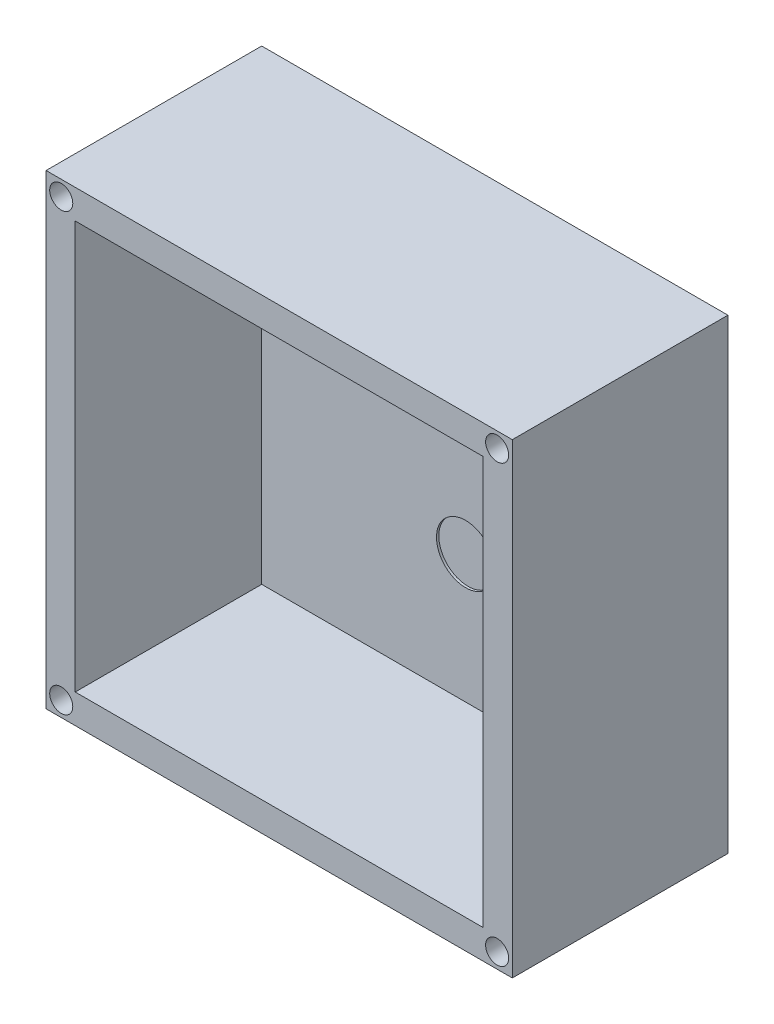
ISO-10303-21;
HEADER;
FILE_DESCRIPTION(('STEP AP214'),'2;1');
FILE_NAME('part.step','',(''),(''),'','','');
FILE_SCHEMA(('AUTOMOTIVE_DESIGN { 1 0 10303 214 1 1 1 1 }'));
ENDSEC;
DATA;
#1=APPLICATION_CONTEXT('core data for automotive mechanical design processes');
#2=APPLICATION_PROTOCOL_DEFINITION('international standard','automotive_design',2000,#1);
#3=PRODUCT_CONTEXT('',#1,'mechanical');
#4=PRODUCT('Part','Part','',(#3));
#5=PRODUCT_RELATED_PRODUCT_CATEGORY('part','',(#4));
#6=PRODUCT_DEFINITION_FORMATION('','',#4);
#7=PRODUCT_DEFINITION_CONTEXT('part definition',#1,'design');
#8=PRODUCT_DEFINITION('design','',#6,#7);
#9=PRODUCT_DEFINITION_SHAPE('','',#8);
#10=(LENGTH_UNIT() NAMED_UNIT(*) SI_UNIT(.MILLI.,.METRE.));
#11=(NAMED_UNIT(*) PLANE_ANGLE_UNIT() SI_UNIT($,.RADIAN.));
#12=(NAMED_UNIT(*) SI_UNIT($,.STERADIAN.) SOLID_ANGLE_UNIT());
#13=UNCERTAINTY_MEASURE_WITH_UNIT(LENGTH_MEASURE(1.E-05),#10,'distance_accuracy_value','');
#14=(GEOMETRIC_REPRESENTATION_CONTEXT(3) GLOBAL_UNCERTAINTY_ASSIGNED_CONTEXT((#13)) GLOBAL_UNIT_ASSIGNED_CONTEXT((#10,
#11,#12)) REPRESENTATION_CONTEXT('',''));
#15=CARTESIAN_POINT('',(0.,0.,0.));
#16=DIRECTION('',(0.,0.,1.));
#17=DIRECTION('',(1.,0.,0.));
#18=AXIS2_PLACEMENT_3D('',#15,#16,#17);
#19=CARTESIAN_POINT('',(0.,0.,3.175));
#20=DIRECTION('',(1.,0.,0.));
#21=DIRECTION('',(0.,1.,0.));
#22=AXIS2_PLACEMENT_3D('',#19,#20,#21);
#23=PLANE('',#22);
#24=DIRECTION('',(0.,-1.,0.));
#25=VECTOR('',#24,1.);
#26=CARTESIAN_POINT('',(0.,0.,0.));
#27=LINE('',#26,#25);
#28=CARTESIAN_POINT('',(0.,50.8,0.));
#29=VERTEX_POINT('',#28);
#30=CARTESIAN_POINT('',(0.,0.,0.));
#31=VERTEX_POINT('',#30);
#32=EDGE_CURVE('E158',#29,#31,#27,.T.);
#33=ORIENTED_EDGE('',*,*,#32,.T.);
#34=DIRECTION('',(0.,0.,-1.));
#35=VECTOR('',#34,1.);
#36=CARTESIAN_POINT('',(0.,0.,3.175));
#37=LINE('',#36,#35);
#38=CARTESIAN_POINT('',(0.,0.,23.495));
#39=VERTEX_POINT('',#38);
#40=EDGE_CURVE('E11',#39,#31,#37,.T.);
#41=ORIENTED_EDGE('',*,*,#40,.F.);
#42=DIRECTION('',(0.,-1.,0.));
#43=VECTOR('',#42,1.);
#44=CARTESIAN_POINT('',(0.,50.8,23.495));
#45=LINE('',#44,#43);
#46=CARTESIAN_POINT('',(0.,50.8,23.495));
#47=VERTEX_POINT('',#46);
#48=EDGE_CURVE('E121',#47,#39,#45,.T.);
#49=ORIENTED_EDGE('',*,*,#48,.F.);
#50=DIRECTION('',(0.,0.,-1.));
#51=VECTOR('',#50,1.);
#52=CARTESIAN_POINT('',(0.,50.8,3.175));
#53=LINE('',#52,#51);
#54=EDGE_CURVE('E166',#47,#29,#53,.T.);
#55=ORIENTED_EDGE('',*,*,#54,.T.);
#56=EDGE_LOOP('',(#33,#41,#49,#55));
#57=FACE_BOUND('',#56,.T.);
#58=ADVANCED_FACE('F39',(#57),#23,.F.);
#59=CARTESIAN_POINT('',(0.,0.,3.175));
#60=DIRECTION('',(0.,1.,0.));
#61=DIRECTION('',(0.,0.,1.));
#62=AXIS2_PLACEMENT_3D('',#59,#60,#61);
#63=PLANE('',#62);
#64=DIRECTION('',(1.,0.,0.));
#65=VECTOR('',#64,1.);
#66=CARTESIAN_POINT('',(0.,0.,0.));
#67=LINE('',#66,#65);
#68=CARTESIAN_POINT('',(50.8,0.,0.));
#69=VERTEX_POINT('',#68);
#70=EDGE_CURVE('E161',#31,#69,#67,.T.);
#71=ORIENTED_EDGE('',*,*,#70,.T.);
#72=DIRECTION('',(0.,0.,-1.));
#73=VECTOR('',#72,1.);
#74=CARTESIAN_POINT('',(50.8,0.,3.175));
#75=LINE('',#74,#73);
#76=CARTESIAN_POINT('',(50.8,0.,23.495));
#77=VERTEX_POINT('',#76);
#78=EDGE_CURVE('E46',#77,#69,#75,.T.);
#79=ORIENTED_EDGE('',*,*,#78,.F.);
#80=DIRECTION('',(1.,0.,0.));
#81=VECTOR('',#80,1.);
#82=CARTESIAN_POINT('',(0.,0.,23.495));
#83=LINE('',#82,#81);
#84=EDGE_CURVE('E149',#39,#77,#83,.T.);
#85=ORIENTED_EDGE('',*,*,#84,.F.);
#86=ORIENTED_EDGE('',*,*,#40,.T.);
#87=EDGE_LOOP('',(#71,#79,#85,#86));
#88=FACE_BOUND('',#87,.T.);
#89=ADVANCED_FACE('F184',(#88),#63,.F.);
#90=CARTESIAN_POINT('',(50.8,0.,3.175));
#91=DIRECTION('',(-1.,0.,0.));
#92=DIRECTION('',(0.,0.,1.));
#93=AXIS2_PLACEMENT_3D('',#90,#91,#92);
#94=PLANE('',#93);
#95=DIRECTION('',(0.,1.,0.));
#96=VECTOR('',#95,1.);
#97=CARTESIAN_POINT('',(50.8,0.,0.));
#98=LINE('',#97,#96);
#99=CARTESIAN_POINT('',(50.8,50.8,0.));
#100=VERTEX_POINT('',#99);
#101=EDGE_CURVE('E163',#69,#100,#98,.T.);
#102=ORIENTED_EDGE('',*,*,#101,.T.);
#103=DIRECTION('',(0.,0.,-1.));
#104=VECTOR('',#103,1.);
#105=CARTESIAN_POINT('',(50.8,50.8,3.175));
#106=LINE('',#105,#104);
#107=CARTESIAN_POINT('',(50.8,50.8,23.495));
#108=VERTEX_POINT('',#107);
#109=EDGE_CURVE('E168',#108,#100,#106,.T.);
#110=ORIENTED_EDGE('',*,*,#109,.F.);
#111=DIRECTION('',(0.,1.,0.));
#112=VECTOR('',#111,1.);
#113=CARTESIAN_POINT('',(50.8,50.8,23.495));
#114=LINE('',#113,#112);
#115=EDGE_CURVE('E152',#77,#108,#114,.T.);
#116=ORIENTED_EDGE('',*,*,#115,.F.);
#117=ORIENTED_EDGE('',*,*,#78,.T.);
#118=EDGE_LOOP('',(#102,#110,#116,#117));
#119=FACE_BOUND('',#118,.T.);
#120=ADVANCED_FACE('F173',(#119),#94,.F.);
#121=CARTESIAN_POINT('',(0.,50.8,3.175));
#122=DIRECTION('',(0.,-1.,0.));
#123=DIRECTION('',(0.,0.,-1.));
#124=AXIS2_PLACEMENT_3D('',#121,#122,#123);
#125=PLANE('',#124);
#126=DIRECTION('',(-1.,0.,0.));
#127=VECTOR('',#126,1.);
#128=CARTESIAN_POINT('',(0.,50.8,0.));
#129=LINE('',#128,#127);
#130=EDGE_CURVE('E61',#100,#29,#129,.T.);
#131=ORIENTED_EDGE('',*,*,#130,.T.);
#132=ORIENTED_EDGE('',*,*,#54,.F.);
#133=DIRECTION('',(-1.,0.,0.));
#134=VECTOR('',#133,1.);
#135=CARTESIAN_POINT('',(0.,50.8,23.495));
#136=LINE('',#135,#134);
#137=EDGE_CURVE('E155',#108,#47,#136,.T.);
#138=ORIENTED_EDGE('',*,*,#137,.F.);
#139=ORIENTED_EDGE('',*,*,#109,.T.);
#140=EDGE_LOOP('',(#131,#132,#138,#139));
#141=FACE_BOUND('',#140,.T.);
#142=ADVANCED_FACE('F182',(#141),#125,.F.);
#143=CARTESIAN_POINT('',(0.,0.,0.));
#144=DIRECTION('',(0.,0.,-1.));
#145=DIRECTION('',(-1.,0.,0.));
#146=AXIS2_PLACEMENT_3D('',#143,#144,#145);
#147=PLANE('',#146);
#148=CARTESIAN_POINT('',(25.39365,35.1409,0.));
#149=DIRECTION('',(0.,0.,1.));
#150=DIRECTION('',(1.,0.,0.));
#151=AXIS2_PLACEMENT_3D('',#148,#149,#150);
#152=CIRCLE('',#151,3.175);
#153=CARTESIAN_POINT('',(28.56865,35.1409,0.));
#154=VERTEX_POINT('',#153);
#155=EDGE_CURVE('E263',#154,#154,#152,.T.);
#156=ORIENTED_EDGE('',*,*,#155,.T.);
#157=EDGE_LOOP('',(#156));
#158=FACE_BOUND('',#157,.T.);
#159=ORIENTED_EDGE('',*,*,#32,.F.);
#160=ORIENTED_EDGE('',*,*,#130,.F.);
#161=ORIENTED_EDGE('',*,*,#101,.F.);
#162=ORIENTED_EDGE('',*,*,#70,.F.);
#163=EDGE_LOOP('',(#159,#160,#161,#162));
#164=FACE_BOUND('',#163,.T.);
#165=ADVANCED_FACE('F178',(#158,#164),#147,.T.);
#166=CARTESIAN_POINT('',(0.,0.,23.495));
#167=DIRECTION('',(0.,0.,1.));
#168=DIRECTION('',(1.,0.,0.));
#169=AXIS2_PLACEMENT_3D('',#166,#167,#168);
#170=PLANE('',#169);
#171=CARTESIAN_POINT('',(1.65099999999998,1.651,23.495));
#172=DIRECTION('',(0.,0.,1.));
#173=DIRECTION('',(1.,0.,0.));
#174=AXIS2_PLACEMENT_3D('',#171,#172,#173);
#175=CIRCLE('',#174,1.2573);
#176=CARTESIAN_POINT('',(2.90829999999998,1.651,23.495));
#177=VERTEX_POINT('',#176);
#178=EDGE_CURVE('E284',#177,#177,#175,.T.);
#179=ORIENTED_EDGE('',*,*,#178,.F.);
#180=EDGE_LOOP('',(#179));
#181=FACE_BOUND('',#180,.T.);
#182=CARTESIAN_POINT('',(49.149,1.651,23.495));
#183=DIRECTION('',(0.,0.,1.));
#184=DIRECTION('',(1.,0.,0.));
#185=AXIS2_PLACEMENT_3D('',#182,#183,#184);
#186=CIRCLE('',#185,1.2573);
#187=CARTESIAN_POINT('',(50.4063,1.651,23.495));
#188=VERTEX_POINT('',#187);
#189=EDGE_CURVE('E278',#188,#188,#186,.T.);
#190=ORIENTED_EDGE('',*,*,#189,.F.);
#191=EDGE_LOOP('',(#190));
#192=FACE_BOUND('',#191,.T.);
#193=CARTESIAN_POINT('',(49.149,49.149,23.495));
#194=DIRECTION('',(0.,0.,1.));
#195=DIRECTION('',(1.,0.,0.));
#196=AXIS2_PLACEMENT_3D('',#193,#194,#195);
#197=CIRCLE('',#196,1.2573);
#198=CARTESIAN_POINT('',(50.4063,49.149,23.495));
#199=VERTEX_POINT('',#198);
#200=EDGE_CURVE('E271',#199,#199,#197,.T.);
#201=ORIENTED_EDGE('',*,*,#200,.F.);
#202=EDGE_LOOP('',(#201));
#203=FACE_BOUND('',#202,.T.);
#204=CARTESIAN_POINT('',(1.65100000000001,49.149,23.495));
#205=DIRECTION('',(0.,0.,1.));
#206=DIRECTION('',(1.,0.,0.));
#207=AXIS2_PLACEMENT_3D('',#204,#205,#206);
#208=CIRCLE('',#207,1.2573);
#209=CARTESIAN_POINT('',(2.9083,49.149,23.495));
#210=VERTEX_POINT('',#209);
#211=EDGE_CURVE('E274',#210,#210,#208,.T.);
#212=ORIENTED_EDGE('',*,*,#211,.F.);
#213=EDGE_LOOP('',(#212));
#214=FACE_BOUND('',#213,.T.);
#215=ORIENTED_EDGE('',*,*,#48,.T.);
#216=ORIENTED_EDGE('',*,*,#84,.T.);
#217=ORIENTED_EDGE('',*,*,#115,.T.);
#218=ORIENTED_EDGE('',*,*,#137,.T.);
#219=EDGE_LOOP('',(#215,#216,#217,#218));
#220=FACE_BOUND('',#219,.T.);
#221=DIRECTION('',(1.,0.,0.));
#222=VECTOR('',#221,1.);
#223=CARTESIAN_POINT('',(3.175,3.175,23.495));
#224=LINE('',#223,#222);
#225=CARTESIAN_POINT('',(3.175,3.175,23.495));
#226=VERTEX_POINT('',#225);
#227=CARTESIAN_POINT('',(47.6123,3.175,23.495));
#228=VERTEX_POINT('',#227);
#229=EDGE_CURVE('E113',#226,#228,#224,.T.);
#230=ORIENTED_EDGE('',*,*,#229,.F.);
#231=DIRECTION('',(0.,-1.,0.));
#232=VECTOR('',#231,1.);
#233=CARTESIAN_POINT('',(3.175,47.625,23.495));
#234=LINE('',#233,#232);
#235=CARTESIAN_POINT('',(3.175,47.625,23.495));
#236=VERTEX_POINT('',#235);
#237=EDGE_CURVE('E105',#236,#226,#234,.T.);
#238=ORIENTED_EDGE('',*,*,#237,.F.);
#239=DIRECTION('',(-1.,0.,0.));
#240=VECTOR('',#239,1.);
#241=CARTESIAN_POINT('',(3.175,47.625,23.495));
#242=LINE('',#241,#240);
#243=CARTESIAN_POINT('',(47.6123,47.625,23.495));
#244=VERTEX_POINT('',#243);
#245=EDGE_CURVE('E129',#244,#236,#242,.T.);
#246=ORIENTED_EDGE('',*,*,#245,.F.);
#247=DIRECTION('',(0.,1.,0.));
#248=VECTOR('',#247,1.);
#249=CARTESIAN_POINT('',(47.6123,47.625,23.495));
#250=LINE('',#249,#248);
#251=EDGE_CURVE('E127',#228,#244,#250,.T.);
#252=ORIENTED_EDGE('',*,*,#251,.F.);
#253=EDGE_LOOP('',(#230,#238,#246,#252));
#254=FACE_BOUND('',#253,.T.);
#255=ADVANCED_FACE('F125',(#181,#192,#203,#214,#220,#254),#170,.T.);
#256=CARTESIAN_POINT('',(3.175,47.625,23.495));
#257=DIRECTION('',(1.,0.,0.));
#258=DIRECTION('',(0.,1.,0.));
#259=AXIS2_PLACEMENT_3D('',#256,#257,#258);
#260=PLANE('',#259);
#261=DIRECTION('',(0.,-1.,0.));
#262=VECTOR('',#261,1.);
#263=CARTESIAN_POINT('',(3.175,47.625,3.175));
#264=LINE('',#263,#262);
#265=CARTESIAN_POINT('',(3.175,47.625,3.175));
#266=VERTEX_POINT('',#265);
#267=CARTESIAN_POINT('',(3.175,3.175,3.175));
#268=VERTEX_POINT('',#267);
#269=EDGE_CURVE('E134',#266,#268,#264,.T.);
#270=ORIENTED_EDGE('',*,*,#269,.F.);
#271=DIRECTION('',(0.,0.,-1.));
#272=VECTOR('',#271,1.);
#273=CARTESIAN_POINT('',(3.175,47.625,23.495));
#274=LINE('',#273,#272);
#275=EDGE_CURVE('E53',#236,#266,#274,.T.);
#276=ORIENTED_EDGE('',*,*,#275,.F.);
#277=ORIENTED_EDGE('',*,*,#237,.T.);
#278=DIRECTION('',(0.,0.,-1.));
#279=VECTOR('',#278,1.);
#280=CARTESIAN_POINT('',(3.175,3.175,23.495));
#281=LINE('',#280,#279);
#282=EDGE_CURVE('E108',#226,#268,#281,.T.);
#283=ORIENTED_EDGE('',*,*,#282,.T.);
#284=EDGE_LOOP('',(#270,#276,#277,#283));
#285=FACE_BOUND('',#284,.T.);
#286=ADVANCED_FACE('F107',(#285),#260,.T.);
#287=CARTESIAN_POINT('',(3.175,3.175,23.495));
#288=DIRECTION('',(0.,1.,0.));
#289=DIRECTION('',(0.,0.,1.));
#290=AXIS2_PLACEMENT_3D('',#287,#288,#289);
#291=PLANE('',#290);
#292=DIRECTION('',(1.,0.,0.));
#293=VECTOR('',#292,1.);
#294=CARTESIAN_POINT('',(3.175,3.175,3.175));
#295=LINE('',#294,#293);
#296=CARTESIAN_POINT('',(47.6123,3.175,3.175));
#297=VERTEX_POINT('',#296);
#298=EDGE_CURVE('E120',#268,#297,#295,.T.);
#299=ORIENTED_EDGE('',*,*,#298,.F.);
#300=ORIENTED_EDGE('',*,*,#282,.F.);
#301=ORIENTED_EDGE('',*,*,#229,.T.);
#302=DIRECTION('',(0.,0.,-1.));
#303=VECTOR('',#302,1.);
#304=CARTESIAN_POINT('',(47.6123,3.175,23.495));
#305=LINE('',#304,#303);
#306=EDGE_CURVE('E122',#228,#297,#305,.T.);
#307=ORIENTED_EDGE('',*,*,#306,.T.);
#308=EDGE_LOOP('',(#299,#300,#301,#307));
#309=FACE_BOUND('',#308,.T.);
#310=ADVANCED_FACE('F117',(#309),#291,.T.);
#311=CARTESIAN_POINT('',(47.6123,47.625,23.495));
#312=DIRECTION('',(-1.,0.,0.));
#313=DIRECTION('',(0.,-1.,0.));
#314=AXIS2_PLACEMENT_3D('',#311,#312,#313);
#315=PLANE('',#314);
#316=DIRECTION('',(0.,1.,0.));
#317=VECTOR('',#316,1.);
#318=CARTESIAN_POINT('',(47.6123,47.625,3.175));
#319=LINE('',#318,#317);
#320=CARTESIAN_POINT('',(47.6123,47.625,3.175));
#321=VERTEX_POINT('',#320);
#322=EDGE_CURVE('E138',#297,#321,#319,.T.);
#323=ORIENTED_EDGE('',*,*,#322,.F.);
#324=ORIENTED_EDGE('',*,*,#306,.F.);
#325=ORIENTED_EDGE('',*,*,#251,.T.);
#326=DIRECTION('',(0.,0.,-1.));
#327=VECTOR('',#326,1.);
#328=CARTESIAN_POINT('',(47.6123,47.625,23.495));
#329=LINE('',#328,#327);
#330=EDGE_CURVE('E144',#244,#321,#329,.T.);
#331=ORIENTED_EDGE('',*,*,#330,.T.);
#332=EDGE_LOOP('',(#323,#324,#325,#331));
#333=FACE_BOUND('',#332,.T.);
#334=ADVANCED_FACE('F210',(#333),#315,.T.);
#335=CARTESIAN_POINT('',(3.175,47.625,23.495));
#336=DIRECTION('',(0.,-1.,0.));
#337=DIRECTION('',(0.,0.,-1.));
#338=AXIS2_PLACEMENT_3D('',#335,#336,#337);
#339=PLANE('',#338);
#340=DIRECTION('',(-1.,0.,0.));
#341=VECTOR('',#340,1.);
#342=CARTESIAN_POINT('',(3.175,47.625,3.175));
#343=LINE('',#342,#341);
#344=EDGE_CURVE('E114',#321,#266,#343,.T.);
#345=ORIENTED_EDGE('',*,*,#344,.F.);
#346=ORIENTED_EDGE('',*,*,#330,.F.);
#347=ORIENTED_EDGE('',*,*,#245,.T.);
#348=ORIENTED_EDGE('',*,*,#275,.T.);
#349=EDGE_LOOP('',(#345,#346,#347,#348));
#350=FACE_BOUND('',#349,.T.);
#351=ADVANCED_FACE('F201',(#350),#339,.T.);
#352=CARTESIAN_POINT('',(0.,0.,3.175));
#353=DIRECTION('',(0.,0.,-1.));
#354=DIRECTION('',(-1.,0.,0.));
#355=AXIS2_PLACEMENT_3D('',#352,#353,#354);
#356=PLANE('',#355);
#357=CARTESIAN_POINT('',(25.39365,35.1409,3.175));
#358=DIRECTION('',(0.,0.,1.));
#359=DIRECTION('',(1.,0.,0.));
#360=AXIS2_PLACEMENT_3D('',#357,#358,#359);
#361=CIRCLE('',#360,3.175);
#362=CARTESIAN_POINT('',(28.56865,35.1409,3.175));
#363=VERTEX_POINT('',#362);
#364=EDGE_CURVE('E266',#363,#363,#361,.T.);
#365=ORIENTED_EDGE('',*,*,#364,.F.);
#366=EDGE_LOOP('',(#365));
#367=FACE_BOUND('',#366,.T.);
#368=CARTESIAN_POINT('',(25.39365,17.145,3.175));
#369=DIRECTION('',(0.,0.,1.));
#370=DIRECTION('',(1.,0.,0.));
#371=AXIS2_PLACEMENT_3D('',#368,#369,#370);
#372=CIRCLE('',#371,3.175);
#373=CARTESIAN_POINT('',(28.56865,17.145,3.175));
#374=VERTEX_POINT('',#373);
#375=EDGE_CURVE('E292',#374,#374,#372,.T.);
#376=ORIENTED_EDGE('',*,*,#375,.F.);
#377=EDGE_LOOP('',(#376));
#378=FACE_BOUND('',#377,.T.);
#379=ORIENTED_EDGE('',*,*,#344,.T.);
#380=ORIENTED_EDGE('',*,*,#269,.T.);
#381=ORIENTED_EDGE('',*,*,#298,.T.);
#382=ORIENTED_EDGE('',*,*,#322,.T.);
#383=EDGE_LOOP('',(#379,#380,#381,#382));
#384=FACE_BOUND('',#383,.T.);
#385=ADVANCED_FACE('F197',(#367,#378,#384),#356,.F.);
#386=CARTESIAN_POINT('',(25.39365,17.145,2.921));
#387=DIRECTION('',(0.,0.,1.));
#388=DIRECTION('',(1.,0.,0.));
#389=AXIS2_PLACEMENT_3D('',#386,#387,#388);
#390=CYLINDRICAL_SURFACE('',#389,3.175);
#391=CARTESIAN_POINT('',(25.39365,17.145,2.921));
#392=DIRECTION('',(0.,0.,1.));
#393=DIRECTION('',(1.,0.,0.));
#394=AXIS2_PLACEMENT_3D('',#391,#392,#393);
#395=CIRCLE('',#394,3.175);
#396=CARTESIAN_POINT('',(28.56865,17.145,2.921));
#397=VERTEX_POINT('',#396);
#398=EDGE_CURVE('E136',#397,#397,#395,.T.);
#399=ORIENTED_EDGE('',*,*,#398,.F.);
#400=EDGE_LOOP('',(#399));
#401=FACE_BOUND('',#400,.T.);
#402=ORIENTED_EDGE('',*,*,#375,.T.);
#403=EDGE_LOOP('',(#402));
#404=FACE_BOUND('',#403,.T.);
#405=ADVANCED_FACE('F200',(#401,#404),#390,.F.);
#406=CARTESIAN_POINT('',(25.39365,17.145,2.921));
#407=DIRECTION('',(0.,0.,1.));
#408=DIRECTION('',(1.,0.,0.));
#409=AXIS2_PLACEMENT_3D('',#406,#407,#408);
#410=PLANE('',#409);
#411=ORIENTED_EDGE('',*,*,#398,.T.);
#412=EDGE_LOOP('',(#411));
#413=FACE_BOUND('',#412,.T.);
#414=ADVANCED_FACE('F218',(#413),#410,.T.);
#415=CARTESIAN_POINT('',(1.65100000000001,49.149,13.97));
#416=DIRECTION('',(0.,0.,1.));
#417=DIRECTION('',(1.,0.,0.));
#418=AXIS2_PLACEMENT_3D('',#415,#416,#417);
#419=CYLINDRICAL_SURFACE('',#418,1.2573);
#420=CARTESIAN_POINT('',(1.65100000000001,49.149,13.97));
#421=DIRECTION('',(0.,0.,1.));
#422=DIRECTION('',(1.,0.,0.));
#423=AXIS2_PLACEMENT_3D('',#420,#421,#422);
#424=CIRCLE('',#423,1.2573);
#425=CARTESIAN_POINT('',(2.9083,49.149,13.97));
#426=VERTEX_POINT('',#425);
#427=EDGE_CURVE('E289',#426,#426,#424,.T.);
#428=CARTESIAN_POINT('',(2.9083,49.149,13.97));
#429=CARTESIAN_POINT('',(2.9083,49.149,14.06921875));
#430=CARTESIAN_POINT('',(2.9083,49.149,14.1684375));
#431=CARTESIAN_POINT('',(2.9083,49.149,14.366875));
#432=CARTESIAN_POINT('',(2.9083,49.149,14.46609375));
#433=CARTESIAN_POINT('',(2.9083,49.149,14.66453125));
#434=CARTESIAN_POINT('',(2.9083,49.149,14.76375));
#435=CARTESIAN_POINT('',(2.9083,49.149,14.9621875));
#436=CARTESIAN_POINT('',(2.9083,49.149,15.06140625));
#437=CARTESIAN_POINT('',(2.9083,49.149,15.25984375));
#438=CARTESIAN_POINT('',(2.9083,49.149,15.3590625));
#439=CARTESIAN_POINT('',(2.9083,49.149,15.5575));
#440=CARTESIAN_POINT('',(2.9083,49.149,15.65671875));
#441=CARTESIAN_POINT('',(2.9083,49.149,15.85515625));
#442=CARTESIAN_POINT('',(2.9083,49.149,15.954375));
#443=CARTESIAN_POINT('',(2.9083,49.149,16.1528125));
#444=CARTESIAN_POINT('',(2.9083,49.149,16.25203125));
#445=CARTESIAN_POINT('',(2.9083,49.149,16.45046875));
#446=CARTESIAN_POINT('',(2.9083,49.149,16.5496875));
#447=CARTESIAN_POINT('',(2.9083,49.149,16.748125));
#448=CARTESIAN_POINT('',(2.9083,49.149,16.84734375));
#449=CARTESIAN_POINT('',(2.9083,49.149,17.04578125));
#450=CARTESIAN_POINT('',(2.9083,49.149,17.145));
#451=CARTESIAN_POINT('',(2.9083,49.149,17.3434375));
#452=CARTESIAN_POINT('',(2.9083,49.149,17.44265625));
#453=CARTESIAN_POINT('',(2.9083,49.149,17.64109375));
#454=CARTESIAN_POINT('',(2.9083,49.149,17.7403125));
#455=CARTESIAN_POINT('',(2.9083,49.149,17.93875));
#456=CARTESIAN_POINT('',(2.9083,49.149,18.03796875));
#457=CARTESIAN_POINT('',(2.9083,49.149,18.23640625));
#458=CARTESIAN_POINT('',(2.9083,49.149,18.335625));
#459=CARTESIAN_POINT('',(2.9083,49.149,18.5340625));
#460=CARTESIAN_POINT('',(2.9083,49.149,18.63328125));
#461=CARTESIAN_POINT('',(2.9083,49.149,18.83171875));
#462=CARTESIAN_POINT('',(2.9083,49.149,18.9309375));
#463=CARTESIAN_POINT('',(2.9083,49.149,19.129375));
#464=CARTESIAN_POINT('',(2.9083,49.149,19.22859375));
#465=CARTESIAN_POINT('',(2.9083,49.149,19.42703125));
#466=CARTESIAN_POINT('',(2.9083,49.149,19.52625));
#467=CARTESIAN_POINT('',(2.9083,49.149,19.7246875));
#468=CARTESIAN_POINT('',(2.9083,49.149,19.82390625));
#469=CARTESIAN_POINT('',(2.9083,49.149,20.02234375));
#470=CARTESIAN_POINT('',(2.9083,49.149,20.1215625));
#471=CARTESIAN_POINT('',(2.9083,49.149,20.32));
#472=CARTESIAN_POINT('',(2.9083,49.149,20.41921875));
#473=CARTESIAN_POINT('',(2.9083,49.149,20.61765625));
#474=CARTESIAN_POINT('',(2.9083,49.149,20.716875));
#475=CARTESIAN_POINT('',(2.9083,49.149,20.9153125));
#476=CARTESIAN_POINT('',(2.9083,49.149,21.01453125));
#477=CARTESIAN_POINT('',(2.9083,49.149,21.21296875));
#478=CARTESIAN_POINT('',(2.9083,49.149,21.3121875));
#479=CARTESIAN_POINT('',(2.9083,49.149,21.510625));
#480=CARTESIAN_POINT('',(2.9083,49.149,21.60984375));
#481=CARTESIAN_POINT('',(2.9083,49.149,21.80828125));
#482=CARTESIAN_POINT('',(2.9083,49.149,21.9075));
#483=CARTESIAN_POINT('',(2.9083,49.149,22.1059375));
#484=CARTESIAN_POINT('',(2.9083,49.149,22.20515625));
#485=CARTESIAN_POINT('',(2.9083,49.149,22.40359375));
#486=CARTESIAN_POINT('',(2.9083,49.149,22.5028125));
#487=CARTESIAN_POINT('',(2.9083,49.149,22.70125));
#488=CARTESIAN_POINT('',(2.9083,49.149,22.80046875));
#489=CARTESIAN_POINT('',(2.9083,49.149,22.99890625));
#490=CARTESIAN_POINT('',(2.9083,49.149,23.098125));
#491=CARTESIAN_POINT('',(2.9083,49.149,23.2965625));
#492=CARTESIAN_POINT('',(2.9083,49.149,23.39578125));
#493=CARTESIAN_POINT('',(2.9083,49.149,23.495));
#494=B_SPLINE_CURVE_WITH_KNOTS('',3,(#428,#429,#430,#431,#432,#433,#434,#435,#436,#437,#438,
#439,#440,#441,#442,#443,#444,#445,#446,#447,#448,#449,#450,#451,#452,#453,#454,#455,#456,#457,
#458,#459,#460,#461,#462,#463,#464,#465,#466,#467,#468,#469,#470,#471,#472,#473,#474,#475,#476,
#477,#478,#479,#480,#481,#482,#483,#484,#485,#486,#487,#488,#489,#490,#491,#492,#493),
.UNSPECIFIED.,.F.,.F.,(4,2,2,2,2,2,2,2,2,2,2,2,2,2,2,2,2,2,2,2,2,2,2,2,2,2,2,2,2,2,2,2,4),(0.,
0.29765625,0.5953125,0.892968750000001,1.190625,1.48828125,1.7859375,2.08359375,2.38125,
2.67890625,2.9765625,3.27421875,3.571875,3.86953125,4.1671875,4.46484375,4.7625,5.06015625,
5.3578125,5.65546875,5.953125,6.25078125,6.5484375,6.84609375,7.14375,7.44140625,7.7390625,
8.03671875,8.334375,8.63203125,8.9296875,9.22734375,9.525),.UNSPECIFIED.);
#495=EDGE_CURVE('BSEAM222',#426,#210,#494,.T.);
#496=ORIENTED_EDGE('',*,*,#427,.F.);
#497=ORIENTED_EDGE('',*,*,#211,.T.);
#498=ORIENTED_EDGE('',*,*,#495,.T.);
#499=ORIENTED_EDGE('',*,*,#495,.F.);
#500=EDGE_LOOP('',(#496,#498,#497,#499));
#501=FACE_BOUND('',#500,.T.);
#502=ADVANCED_FACE('F222',(#501),#419,.F.);
#503=CARTESIAN_POINT('',(1.65100000000001,49.149,13.97));
#504=DIRECTION('',(0.,0.,1.));
#505=DIRECTION('',(1.,0.,0.));
#506=AXIS2_PLACEMENT_3D('',#503,#504,#505);
#507=PLANE('',#506);
#508=ORIENTED_EDGE('',*,*,#427,.T.);
#509=EDGE_LOOP('',(#508));
#510=FACE_BOUND('',#509,.T.);
#511=ADVANCED_FACE('F226',(#510),#507,.T.);
#512=CARTESIAN_POINT('',(49.149,49.149,13.97));
#513=DIRECTION('',(0.,0.,1.));
#514=DIRECTION('',(1.,0.,0.));
#515=AXIS2_PLACEMENT_3D('',#512,#513,#514);
#516=CYLINDRICAL_SURFACE('',#515,1.2573);
#517=CARTESIAN_POINT('',(49.149,49.149,13.97));
#518=DIRECTION('',(0.,0.,1.));
#519=DIRECTION('',(1.,0.,0.));
#520=AXIS2_PLACEMENT_3D('',#517,#518,#519);
#521=CIRCLE('',#520,1.2573);
#522=CARTESIAN_POINT('',(50.4063,49.149,13.97));
#523=VERTEX_POINT('',#522);
#524=EDGE_CURVE('E275',#523,#523,#521,.T.);
#525=CARTESIAN_POINT('',(50.4063,49.149,13.97));
#526=CARTESIAN_POINT('',(50.4063,49.149,14.06921875));
#527=CARTESIAN_POINT('',(50.4063,49.149,14.1684375));
#528=CARTESIAN_POINT('',(50.4063,49.149,14.366875));
#529=CARTESIAN_POINT('',(50.4063,49.149,14.46609375));
#530=CARTESIAN_POINT('',(50.4063,49.149,14.66453125));
#531=CARTESIAN_POINT('',(50.4063,49.149,14.76375));
#532=CARTESIAN_POINT('',(50.4063,49.149,14.9621875));
#533=CARTESIAN_POINT('',(50.4063,49.149,15.06140625));
#534=CARTESIAN_POINT('',(50.4063,49.149,15.25984375));
#535=CARTESIAN_POINT('',(50.4063,49.149,15.3590625));
#536=CARTESIAN_POINT('',(50.4063,49.149,15.5575));
#537=CARTESIAN_POINT('',(50.4063,49.149,15.65671875));
#538=CARTESIAN_POINT('',(50.4063,49.149,15.85515625));
#539=CARTESIAN_POINT('',(50.4063,49.149,15.954375));
#540=CARTESIAN_POINT('',(50.4063,49.149,16.1528125));
#541=CARTESIAN_POINT('',(50.4063,49.149,16.25203125));
#542=CARTESIAN_POINT('',(50.4063,49.149,16.45046875));
#543=CARTESIAN_POINT('',(50.4063,49.149,16.5496875));
#544=CARTESIAN_POINT('',(50.4063,49.149,16.748125));
#545=CARTESIAN_POINT('',(50.4063,49.149,16.84734375));
#546=CARTESIAN_POINT('',(50.4063,49.149,17.04578125));
#547=CARTESIAN_POINT('',(50.4063,49.149,17.145));
#548=CARTESIAN_POINT('',(50.4063,49.149,17.3434375));
#549=CARTESIAN_POINT('',(50.4063,49.149,17.44265625));
#550=CARTESIAN_POINT('',(50.4063,49.149,17.64109375));
#551=CARTESIAN_POINT('',(50.4063,49.149,17.7403125));
#552=CARTESIAN_POINT('',(50.4063,49.149,17.93875));
#553=CARTESIAN_POINT('',(50.4063,49.149,18.03796875));
#554=CARTESIAN_POINT('',(50.4063,49.149,18.23640625));
#555=CARTESIAN_POINT('',(50.4063,49.149,18.335625));
#556=CARTESIAN_POINT('',(50.4063,49.149,18.5340625));
#557=CARTESIAN_POINT('',(50.4063,49.149,18.63328125));
#558=CARTESIAN_POINT('',(50.4063,49.149,18.83171875));
#559=CARTESIAN_POINT('',(50.4063,49.149,18.9309375));
#560=CARTESIAN_POINT('',(50.4063,49.149,19.129375));
#561=CARTESIAN_POINT('',(50.4063,49.149,19.22859375));
#562=CARTESIAN_POINT('',(50.4063,49.149,19.42703125));
#563=CARTESIAN_POINT('',(50.4063,49.149,19.52625));
#564=CARTESIAN_POINT('',(50.4063,49.149,19.7246875));
#565=CARTESIAN_POINT('',(50.4063,49.149,19.82390625));
#566=CARTESIAN_POINT('',(50.4063,49.149,20.02234375));
#567=CARTESIAN_POINT('',(50.4063,49.149,20.1215625));
#568=CARTESIAN_POINT('',(50.4063,49.149,20.32));
#569=CARTESIAN_POINT('',(50.4063,49.149,20.41921875));
#570=CARTESIAN_POINT('',(50.4063,49.149,20.61765625));
#571=CARTESIAN_POINT('',(50.4063,49.149,20.716875));
#572=CARTESIAN_POINT('',(50.4063,49.149,20.9153125));
#573=CARTESIAN_POINT('',(50.4063,49.149,21.01453125));
#574=CARTESIAN_POINT('',(50.4063,49.149,21.21296875));
#575=CARTESIAN_POINT('',(50.4063,49.149,21.3121875));
#576=CARTESIAN_POINT('',(50.4063,49.149,21.510625));
#577=CARTESIAN_POINT('',(50.4063,49.149,21.60984375));
#578=CARTESIAN_POINT('',(50.4063,49.149,21.80828125));
#579=CARTESIAN_POINT('',(50.4063,49.149,21.9075));
#580=CARTESIAN_POINT('',(50.4063,49.149,22.1059375));
#581=CARTESIAN_POINT('',(50.4063,49.149,22.20515625));
#582=CARTESIAN_POINT('',(50.4063,49.149,22.40359375));
#583=CARTESIAN_POINT('',(50.4063,49.149,22.5028125));
#584=CARTESIAN_POINT('',(50.4063,49.149,22.70125));
#585=CARTESIAN_POINT('',(50.4063,49.149,22.80046875));
#586=CARTESIAN_POINT('',(50.4063,49.149,22.99890625));
#587=CARTESIAN_POINT('',(50.4063,49.149,23.098125));
#588=CARTESIAN_POINT('',(50.4063,49.149,23.2965625));
#589=CARTESIAN_POINT('',(50.4063,49.149,23.39578125));
#590=CARTESIAN_POINT('',(50.4063,49.149,23.495));
#591=B_SPLINE_CURVE_WITH_KNOTS('',3,(#525,#526,#527,#528,#529,#530,#531,#532,#533,#534,#535,
#536,#537,#538,#539,#540,#541,#542,#543,#544,#545,#546,#547,#548,#549,#550,#551,#552,#553,#554,
#555,#556,#557,#558,#559,#560,#561,#562,#563,#564,#565,#566,#567,#568,#569,#570,#571,#572,#573,
#574,#575,#576,#577,#578,#579,#580,#581,#582,#583,#584,#585,#586,#587,#588,#589,#590),
.UNSPECIFIED.,.F.,.F.,(4,2,2,2,2,2,2,2,2,2,2,2,2,2,2,2,2,2,2,2,2,2,2,2,2,2,2,2,2,2,2,2,4),(0.,
0.29765625,0.5953125,0.892968750000001,1.190625,1.48828125,1.7859375,2.08359375,2.38125,
2.67890625,2.9765625,3.27421875,3.571875,3.86953125,4.1671875,4.46484375,4.7625,5.06015625,
5.3578125,5.65546875,5.953125,6.25078125,6.5484375,6.84609375,7.14375,7.44140625,7.7390625,
8.03671875,8.334375,8.63203125,8.9296875,9.22734375,9.525),.UNSPECIFIED.);
#592=EDGE_CURVE('BSEAM230',#523,#199,#591,.T.);
#593=ORIENTED_EDGE('',*,*,#524,.F.);
#594=ORIENTED_EDGE('',*,*,#200,.T.);
#595=ORIENTED_EDGE('',*,*,#592,.T.);
#596=ORIENTED_EDGE('',*,*,#592,.F.);
#597=EDGE_LOOP('',(#593,#595,#594,#596));
#598=FACE_BOUND('',#597,.T.);
#599=ADVANCED_FACE('F230',(#598),#516,.F.);
#600=CARTESIAN_POINT('',(49.149,49.149,13.97));
#601=DIRECTION('',(0.,0.,1.));
#602=DIRECTION('',(1.,0.,0.));
#603=AXIS2_PLACEMENT_3D('',#600,#601,#602);
#604=PLANE('',#603);
#605=ORIENTED_EDGE('',*,*,#524,.T.);
#606=EDGE_LOOP('',(#605));
#607=FACE_BOUND('',#606,.T.);
#608=ADVANCED_FACE('F248',(#607),#604,.T.);
#609=CARTESIAN_POINT('',(49.149,1.651,13.97));
#610=DIRECTION('',(0.,0.,1.));
#611=DIRECTION('',(1.,0.,0.));
#612=AXIS2_PLACEMENT_3D('',#609,#610,#611);
#613=CYLINDRICAL_SURFACE('',#612,1.2573);
#614=CARTESIAN_POINT('',(49.149,1.651,13.97));
#615=DIRECTION('',(0.,0.,1.));
#616=DIRECTION('',(1.,0.,0.));
#617=AXIS2_PLACEMENT_3D('',#614,#615,#616);
#618=CIRCLE('',#617,1.2573);
#619=CARTESIAN_POINT('',(50.4063,1.651,13.97));
#620=VERTEX_POINT('',#619);
#621=EDGE_CURVE('E281',#620,#620,#618,.T.);
#622=CARTESIAN_POINT('',(50.4063,1.651,13.97));
#623=CARTESIAN_POINT('',(50.4063,1.651,14.06921875));
#624=CARTESIAN_POINT('',(50.4063,1.651,14.1684375));
#625=CARTESIAN_POINT('',(50.4063,1.651,14.366875));
#626=CARTESIAN_POINT('',(50.4063,1.651,14.46609375));
#627=CARTESIAN_POINT('',(50.4063,1.651,14.66453125));
#628=CARTESIAN_POINT('',(50.4063,1.651,14.76375));
#629=CARTESIAN_POINT('',(50.4063,1.651,14.9621875));
#630=CARTESIAN_POINT('',(50.4063,1.651,15.06140625));
#631=CARTESIAN_POINT('',(50.4063,1.651,15.25984375));
#632=CARTESIAN_POINT('',(50.4063,1.651,15.3590625));
#633=CARTESIAN_POINT('',(50.4063,1.651,15.5575));
#634=CARTESIAN_POINT('',(50.4063,1.651,15.65671875));
#635=CARTESIAN_POINT('',(50.4063,1.651,15.85515625));
#636=CARTESIAN_POINT('',(50.4063,1.651,15.954375));
#637=CARTESIAN_POINT('',(50.4063,1.651,16.1528125));
#638=CARTESIAN_POINT('',(50.4063,1.651,16.25203125));
#639=CARTESIAN_POINT('',(50.4063,1.651,16.45046875));
#640=CARTESIAN_POINT('',(50.4063,1.651,16.5496875));
#641=CARTESIAN_POINT('',(50.4063,1.651,16.748125));
#642=CARTESIAN_POINT('',(50.4063,1.651,16.84734375));
#643=CARTESIAN_POINT('',(50.4063,1.651,17.04578125));
#644=CARTESIAN_POINT('',(50.4063,1.651,17.145));
#645=CARTESIAN_POINT('',(50.4063,1.651,17.3434375));
#646=CARTESIAN_POINT('',(50.4063,1.651,17.44265625));
#647=CARTESIAN_POINT('',(50.4063,1.651,17.64109375));
#648=CARTESIAN_POINT('',(50.4063,1.651,17.7403125));
#649=CARTESIAN_POINT('',(50.4063,1.651,17.93875));
#650=CARTESIAN_POINT('',(50.4063,1.651,18.03796875));
#651=CARTESIAN_POINT('',(50.4063,1.651,18.23640625));
#652=CARTESIAN_POINT('',(50.4063,1.651,18.335625));
#653=CARTESIAN_POINT('',(50.4063,1.651,18.5340625));
#654=CARTESIAN_POINT('',(50.4063,1.651,18.63328125));
#655=CARTESIAN_POINT('',(50.4063,1.651,18.83171875));
#656=CARTESIAN_POINT('',(50.4063,1.651,18.9309375));
#657=CARTESIAN_POINT('',(50.4063,1.651,19.129375));
#658=CARTESIAN_POINT('',(50.4063,1.651,19.22859375));
#659=CARTESIAN_POINT('',(50.4063,1.651,19.42703125));
#660=CARTESIAN_POINT('',(50.4063,1.651,19.52625));
#661=CARTESIAN_POINT('',(50.4063,1.651,19.7246875));
#662=CARTESIAN_POINT('',(50.4063,1.651,19.82390625));
#663=CARTESIAN_POINT('',(50.4063,1.651,20.02234375));
#664=CARTESIAN_POINT('',(50.4063,1.651,20.1215625));
#665=CARTESIAN_POINT('',(50.4063,1.651,20.32));
#666=CARTESIAN_POINT('',(50.4063,1.651,20.41921875));
#667=CARTESIAN_POINT('',(50.4063,1.651,20.61765625));
#668=CARTESIAN_POINT('',(50.4063,1.651,20.716875));
#669=CARTESIAN_POINT('',(50.4063,1.651,20.9153125));
#670=CARTESIAN_POINT('',(50.4063,1.651,21.01453125));
#671=CARTESIAN_POINT('',(50.4063,1.651,21.21296875));
#672=CARTESIAN_POINT('',(50.4063,1.651,21.3121875));
#673=CARTESIAN_POINT('',(50.4063,1.651,21.510625));
#674=CARTESIAN_POINT('',(50.4063,1.651,21.60984375));
#675=CARTESIAN_POINT('',(50.4063,1.651,21.80828125));
#676=CARTESIAN_POINT('',(50.4063,1.651,21.9075));
#677=CARTESIAN_POINT('',(50.4063,1.651,22.1059375));
#678=CARTESIAN_POINT('',(50.4063,1.651,22.20515625));
#679=CARTESIAN_POINT('',(50.4063,1.651,22.40359375));
#680=CARTESIAN_POINT('',(50.4063,1.651,22.5028125));
#681=CARTESIAN_POINT('',(50.4063,1.651,22.70125));
#682=CARTESIAN_POINT('',(50.4063,1.651,22.80046875));
#683=CARTESIAN_POINT('',(50.4063,1.651,22.99890625));
#684=CARTESIAN_POINT('',(50.4063,1.651,23.098125));
#685=CARTESIAN_POINT('',(50.4063,1.651,23.2965625));
#686=CARTESIAN_POINT('',(50.4063,1.651,23.39578125));
#687=CARTESIAN_POINT('',(50.4063,1.651,23.495));
#688=B_SPLINE_CURVE_WITH_KNOTS('',3,(#622,#623,#624,#625,#626,#627,#628,#629,#630,#631,#632,
#633,#634,#635,#636,#637,#638,#639,#640,#641,#642,#643,#644,#645,#646,#647,#648,#649,#650,#651,
#652,#653,#654,#655,#656,#657,#658,#659,#660,#661,#662,#663,#664,#665,#666,#667,#668,#669,#670,
#671,#672,#673,#674,#675,#676,#677,#678,#679,#680,#681,#682,#683,#684,#685,#686,#687),
.UNSPECIFIED.,.F.,.F.,(4,2,2,2,2,2,2,2,2,2,2,2,2,2,2,2,2,2,2,2,2,2,2,2,2,2,2,2,2,2,2,2,4),(0.,
0.29765625,0.5953125,0.892968750000001,1.190625,1.48828125,1.7859375,2.08359375,2.38125,
2.67890625,2.9765625,3.27421875,3.571875,3.86953125,4.1671875,4.46484375,4.7625,5.06015625,
5.3578125,5.65546875,5.953125,6.25078125,6.5484375,6.84609375,7.14375,7.44140625,7.7390625,
8.03671875,8.334375,8.63203125,8.9296875,9.22734375,9.525),.UNSPECIFIED.);
#689=EDGE_CURVE('BSEAM244',#620,#188,#688,.T.);
#690=ORIENTED_EDGE('',*,*,#621,.F.);
#691=ORIENTED_EDGE('',*,*,#189,.T.);
#692=ORIENTED_EDGE('',*,*,#689,.T.);
#693=ORIENTED_EDGE('',*,*,#689,.F.);
#694=EDGE_LOOP('',(#690,#692,#691,#693));
#695=FACE_BOUND('',#694,.T.);
#696=ADVANCED_FACE('F244',(#695),#613,.F.);
#697=CARTESIAN_POINT('',(49.149,1.651,13.97));
#698=DIRECTION('',(0.,0.,1.));
#699=DIRECTION('',(1.,0.,0.));
#700=AXIS2_PLACEMENT_3D('',#697,#698,#699);
#701=PLANE('',#700);
#702=ORIENTED_EDGE('',*,*,#621,.T.);
#703=EDGE_LOOP('',(#702));
#704=FACE_BOUND('',#703,.T.);
#705=ADVANCED_FACE('F240',(#704),#701,.T.);
#706=CARTESIAN_POINT('',(1.65099999999998,1.651,13.97));
#707=DIRECTION('',(0.,0.,1.));
#708=DIRECTION('',(1.,0.,0.));
#709=AXIS2_PLACEMENT_3D('',#706,#707,#708);
#710=CYLINDRICAL_SURFACE('',#709,1.2573);
#711=CARTESIAN_POINT('',(1.65099999999998,1.651,13.97));
#712=DIRECTION('',(0.,0.,1.));
#713=DIRECTION('',(1.,0.,0.));
#714=AXIS2_PLACEMENT_3D('',#711,#712,#713);
#715=CIRCLE('',#714,1.2573);
#716=CARTESIAN_POINT('',(2.90829999999998,1.651,13.97));
#717=VERTEX_POINT('',#716);
#718=EDGE_CURVE('E268',#717,#717,#715,.T.);
#719=CARTESIAN_POINT('',(2.90829999999998,1.651,13.97));
#720=CARTESIAN_POINT('',(2.90829999999998,1.651,14.06921875));
#721=CARTESIAN_POINT('',(2.90829999999998,1.651,14.1684375));
#722=CARTESIAN_POINT('',(2.90829999999998,1.651,14.366875));
#723=CARTESIAN_POINT('',(2.90829999999998,1.651,14.46609375));
#724=CARTESIAN_POINT('',(2.90829999999998,1.651,14.66453125));
#725=CARTESIAN_POINT('',(2.90829999999998,1.651,14.76375));
#726=CARTESIAN_POINT('',(2.90829999999998,1.651,14.9621875));
#727=CARTESIAN_POINT('',(2.90829999999998,1.651,15.06140625));
#728=CARTESIAN_POINT('',(2.90829999999998,1.651,15.25984375));
#729=CARTESIAN_POINT('',(2.90829999999998,1.651,15.3590625));
#730=CARTESIAN_POINT('',(2.90829999999998,1.651,15.5575));
#731=CARTESIAN_POINT('',(2.90829999999998,1.651,15.65671875));
#732=CARTESIAN_POINT('',(2.90829999999998,1.651,15.85515625));
#733=CARTESIAN_POINT('',(2.90829999999998,1.651,15.954375));
#734=CARTESIAN_POINT('',(2.90829999999998,1.651,16.1528125));
#735=CARTESIAN_POINT('',(2.90829999999998,1.651,16.25203125));
#736=CARTESIAN_POINT('',(2.90829999999998,1.651,16.45046875));
#737=CARTESIAN_POINT('',(2.90829999999998,1.651,16.5496875));
#738=CARTESIAN_POINT('',(2.90829999999998,1.651,16.748125));
#739=CARTESIAN_POINT('',(2.90829999999998,1.651,16.84734375));
#740=CARTESIAN_POINT('',(2.90829999999998,1.651,17.04578125));
#741=CARTESIAN_POINT('',(2.90829999999998,1.651,17.145));
#742=CARTESIAN_POINT('',(2.90829999999998,1.651,17.3434375));
#743=CARTESIAN_POINT('',(2.90829999999998,1.651,17.44265625));
#744=CARTESIAN_POINT('',(2.90829999999998,1.651,17.64109375));
#745=CARTESIAN_POINT('',(2.90829999999998,1.651,17.7403125));
#746=CARTESIAN_POINT('',(2.90829999999998,1.651,17.93875));
#747=CARTESIAN_POINT('',(2.90829999999998,1.651,18.03796875));
#748=CARTESIAN_POINT('',(2.90829999999998,1.651,18.23640625));
#749=CARTESIAN_POINT('',(2.90829999999998,1.651,18.335625));
#750=CARTESIAN_POINT('',(2.90829999999998,1.651,18.5340625));
#751=CARTESIAN_POINT('',(2.90829999999998,1.651,18.63328125));
#752=CARTESIAN_POINT('',(2.90829999999998,1.651,18.83171875));
#753=CARTESIAN_POINT('',(2.90829999999998,1.651,18.9309375));
#754=CARTESIAN_POINT('',(2.90829999999998,1.651,19.129375));
#755=CARTESIAN_POINT('',(2.90829999999998,1.651,19.22859375));
#756=CARTESIAN_POINT('',(2.90829999999998,1.651,19.42703125));
#757=CARTESIAN_POINT('',(2.90829999999998,1.651,19.52625));
#758=CARTESIAN_POINT('',(2.90829999999998,1.651,19.7246875));
#759=CARTESIAN_POINT('',(2.90829999999998,1.651,19.82390625));
#760=CARTESIAN_POINT('',(2.90829999999998,1.651,20.02234375));
#761=CARTESIAN_POINT('',(2.90829999999998,1.651,20.1215625));
#762=CARTESIAN_POINT('',(2.90829999999998,1.651,20.32));
#763=CARTESIAN_POINT('',(2.90829999999998,1.651,20.41921875));
#764=CARTESIAN_POINT('',(2.90829999999998,1.651,20.61765625));
#765=CARTESIAN_POINT('',(2.90829999999998,1.651,20.716875));
#766=CARTESIAN_POINT('',(2.90829999999998,1.651,20.9153125));
#767=CARTESIAN_POINT('',(2.90829999999998,1.651,21.01453125));
#768=CARTESIAN_POINT('',(2.90829999999998,1.651,21.21296875));
#769=CARTESIAN_POINT('',(2.90829999999998,1.651,21.3121875));
#770=CARTESIAN_POINT('',(2.90829999999998,1.651,21.510625));
#771=CARTESIAN_POINT('',(2.90829999999998,1.651,21.60984375));
#772=CARTESIAN_POINT('',(2.90829999999998,1.651,21.80828125));
#773=CARTESIAN_POINT('',(2.90829999999998,1.651,21.9075));
#774=CARTESIAN_POINT('',(2.90829999999998,1.651,22.1059375));
#775=CARTESIAN_POINT('',(2.90829999999998,1.651,22.20515625));
#776=CARTESIAN_POINT('',(2.90829999999998,1.651,22.40359375));
#777=CARTESIAN_POINT('',(2.90829999999998,1.651,22.5028125));
#778=CARTESIAN_POINT('',(2.90829999999998,1.651,22.70125));
#779=CARTESIAN_POINT('',(2.90829999999998,1.651,22.80046875));
#780=CARTESIAN_POINT('',(2.90829999999998,1.651,22.99890625));
#781=CARTESIAN_POINT('',(2.90829999999998,1.651,23.098125));
#782=CARTESIAN_POINT('',(2.90829999999998,1.651,23.2965625));
#783=CARTESIAN_POINT('',(2.90829999999998,1.651,23.39578125));
#784=CARTESIAN_POINT('',(2.90829999999998,1.651,23.495));
#785=B_SPLINE_CURVE_WITH_KNOTS('',3,(#719,#720,#721,#722,#723,#724,#725,#726,#727,#728,#729,
#730,#731,#732,#733,#734,#735,#736,#737,#738,#739,#740,#741,#742,#743,#744,#745,#746,#747,#748,
#749,#750,#751,#752,#753,#754,#755,#756,#757,#758,#759,#760,#761,#762,#763,#764,#765,#766,#767,
#768,#769,#770,#771,#772,#773,#774,#775,#776,#777,#778,#779,#780,#781,#782,#783,#784),
.UNSPECIFIED.,.F.,.F.,(4,2,2,2,2,2,2,2,2,2,2,2,2,2,2,2,2,2,2,2,2,2,2,2,2,2,2,2,2,2,2,2,4),(0.,
0.29765625,0.5953125,0.892968750000001,1.190625,1.48828125,1.7859375,2.08359375,2.38125,
2.67890625,2.9765625,3.27421875,3.571875,3.86953125,4.1671875,4.46484375,4.7625,5.06015625,
5.3578125,5.65546875,5.953125,6.25078125,6.5484375,6.84609375,7.14375,7.44140625,7.7390625,
8.03671875,8.334375,8.63203125,8.9296875,9.22734375,9.525),.UNSPECIFIED.);
#786=EDGE_CURVE('BSEAM236',#717,#177,#785,.T.);
#787=ORIENTED_EDGE('',*,*,#718,.F.);
#788=ORIENTED_EDGE('',*,*,#178,.T.);
#789=ORIENTED_EDGE('',*,*,#786,.T.);
#790=ORIENTED_EDGE('',*,*,#786,.F.);
#791=EDGE_LOOP('',(#787,#789,#788,#790));
#792=FACE_BOUND('',#791,.T.);
#793=ADVANCED_FACE('F236',(#792),#710,.F.);
#794=CARTESIAN_POINT('',(1.65099999999998,1.651,13.97));
#795=DIRECTION('',(0.,0.,1.));
#796=DIRECTION('',(1.,0.,0.));
#797=AXIS2_PLACEMENT_3D('',#794,#795,#796);
#798=PLANE('',#797);
#799=ORIENTED_EDGE('',*,*,#718,.T.);
#800=EDGE_LOOP('',(#799));
#801=FACE_BOUND('',#800,.T.);
#802=ADVANCED_FACE('F232',(#801),#798,.T.);
#803=CARTESIAN_POINT('',(25.39365,35.1409,0.));
#804=DIRECTION('',(0.,0.,1.));
#805=DIRECTION('',(1.,0.,0.));
#806=AXIS2_PLACEMENT_3D('',#803,#804,#805);
#807=CYLINDRICAL_SURFACE('',#806,3.175);
#808=ORIENTED_EDGE('',*,*,#155,.F.);
#809=EDGE_LOOP('',(#808));
#810=FACE_BOUND('',#809,.T.);
#811=ORIENTED_EDGE('',*,*,#364,.T.);
#812=EDGE_LOOP('',(#811));
#813=FACE_BOUND('',#812,.T.);
#814=ADVANCED_FACE('F235',(#810,#813),#807,.F.);
#815=CLOSED_SHELL('',(#58,#89,#120,#142,#165,#255,#286,#310,#334,#351,#385,#405,#414,#502,#511,
#599,#608,#696,#705,#793,#802,#814));
#816=MANIFOLD_SOLID_BREP('B2',#815);
#817=ADVANCED_BREP_SHAPE_REPRESENTATION('',(#18,#816),#14);
#818=SHAPE_DEFINITION_REPRESENTATION(#9,#817);
ENDSEC;
END-ISO-10303-21;
